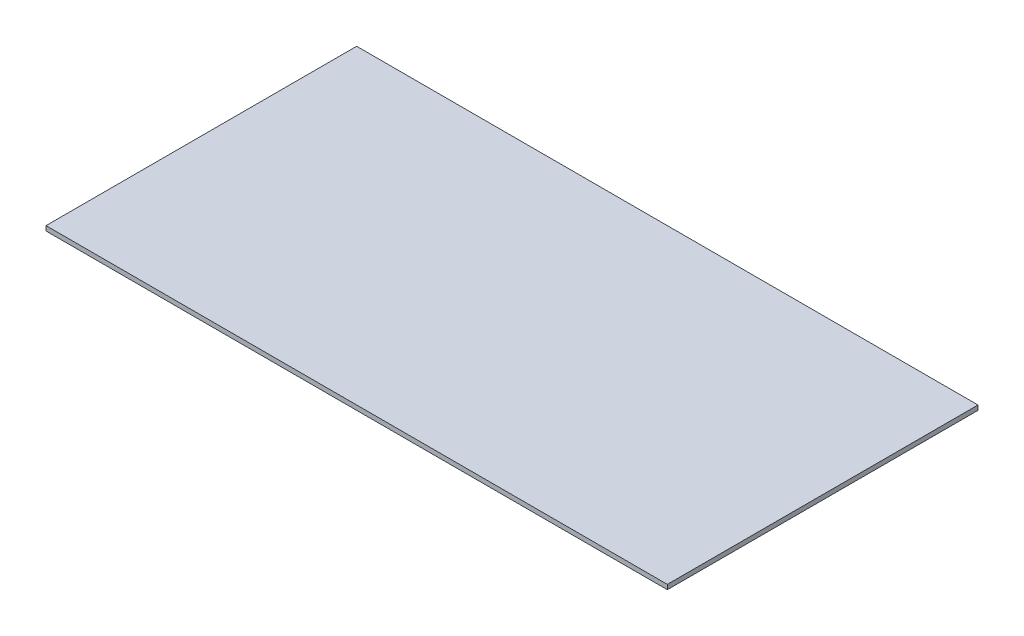
ISO-10303-21;
HEADER;
FILE_DESCRIPTION(('STEP AP214'),'2;1');
FILE_NAME('part.step','',(''),(''),'','','');
FILE_SCHEMA(('AUTOMOTIVE_DESIGN { 1 0 10303 214 1 1 1 1 }'));
ENDSEC;
DATA;
#1=APPLICATION_CONTEXT('core data for automotive mechanical design processes');
#2=APPLICATION_PROTOCOL_DEFINITION('international standard','automotive_design',2000,#1);
#3=PRODUCT_CONTEXT('',#1,'mechanical');
#4=PRODUCT('Part','Part','',(#3));
#5=PRODUCT_RELATED_PRODUCT_CATEGORY('part','',(#4));
#6=PRODUCT_DEFINITION_FORMATION('','',#4);
#7=PRODUCT_DEFINITION_CONTEXT('part definition',#1,'design');
#8=PRODUCT_DEFINITION('design','',#6,#7);
#9=PRODUCT_DEFINITION_SHAPE('','',#8);
#10=(LENGTH_UNIT() NAMED_UNIT(*) SI_UNIT(.MILLI.,.METRE.));
#11=(NAMED_UNIT(*) PLANE_ANGLE_UNIT() SI_UNIT($,.RADIAN.));
#12=(NAMED_UNIT(*) SI_UNIT($,.STERADIAN.) SOLID_ANGLE_UNIT());
#13=UNCERTAINTY_MEASURE_WITH_UNIT(LENGTH_MEASURE(1.E-05),#10,'distance_accuracy_value','');
#14=(GEOMETRIC_REPRESENTATION_CONTEXT(3) GLOBAL_UNCERTAINTY_ASSIGNED_CONTEXT((#13)) GLOBAL_UNIT_ASSIGNED_CONTEXT((#10,
#11,#12)) REPRESENTATION_CONTEXT('',''));
#15=CARTESIAN_POINT('',(0.,0.,0.));
#16=DIRECTION('',(0.,0.,1.));
#17=DIRECTION('',(1.,0.,0.));
#18=AXIS2_PLACEMENT_3D('',#15,#16,#17);
#19=CARTESIAN_POINT('',(0.,3.,0.));
#20=DIRECTION('',(1.,0.,0.));
#21=DIRECTION('',(0.,0.,-1.));
#22=AXIS2_PLACEMENT_3D('',#19,#20,#21);
#23=PLANE('',#22);
#24=DIRECTION('',(0.,0.,1.));
#25=VECTOR('',#24,1.);
#26=CARTESIAN_POINT('',(0.,0.,0.));
#27=LINE('',#26,#25);
#28=CARTESIAN_POINT('',(0.,0.,-200.));
#29=VERTEX_POINT('',#28);
#30=CARTESIAN_POINT('',(0.,0.,0.));
#31=VERTEX_POINT('',#30);
#32=EDGE_CURVE('E107',#29,#31,#27,.T.);
#33=ORIENTED_EDGE('',*,*,#32,.T.);
#34=DIRECTION('',(0.,-1.,0.));
#35=VECTOR('',#34,1.);
#36=CARTESIAN_POINT('',(0.,3.,0.));
#37=LINE('',#36,#35);
#38=CARTESIAN_POINT('',(0.,3.,0.));
#39=VERTEX_POINT('',#38);
#40=EDGE_CURVE('E11',#39,#31,#37,.T.);
#41=ORIENTED_EDGE('',*,*,#40,.F.);
#42=DIRECTION('',(0.,0.,1.));
#43=VECTOR('',#42,1.);
#44=CARTESIAN_POINT('',(0.,3.,0.));
#45=LINE('',#44,#43);
#46=CARTESIAN_POINT('',(0.,3.,-200.));
#47=VERTEX_POINT('',#46);
#48=EDGE_CURVE('E91',#47,#39,#45,.T.);
#49=ORIENTED_EDGE('',*,*,#48,.F.);
#50=DIRECTION('',(0.,-1.,0.));
#51=VECTOR('',#50,1.);
#52=CARTESIAN_POINT('',(0.,3.,-200.));
#53=LINE('',#52,#51);
#54=EDGE_CURVE('E103',#47,#29,#53,.T.);
#55=ORIENTED_EDGE('',*,*,#54,.T.);
#56=EDGE_LOOP('',(#33,#41,#49,#55));
#57=FACE_BOUND('',#56,.T.);
#58=ADVANCED_FACE('F39',(#57),#23,.F.);
#59=CARTESIAN_POINT('',(0.,3.,0.));
#60=DIRECTION('',(0.,0.,-1.));
#61=DIRECTION('',(-1.,0.,0.));
#62=AXIS2_PLACEMENT_3D('',#59,#60,#61);
#63=PLANE('',#62);
#64=DIRECTION('',(1.,0.,0.));
#65=VECTOR('',#64,1.);
#66=CARTESIAN_POINT('',(0.,0.,0.));
#67=LINE('',#66,#65);
#68=CARTESIAN_POINT('',(400.,0.,0.));
#69=VERTEX_POINT('',#68);
#70=EDGE_CURVE('E96',#31,#69,#67,.T.);
#71=ORIENTED_EDGE('',*,*,#70,.T.);
#72=DIRECTION('',(0.,-1.,0.));
#73=VECTOR('',#72,1.);
#74=CARTESIAN_POINT('',(400.,3.,0.));
#75=LINE('',#74,#73);
#76=CARTESIAN_POINT('',(400.,3.,0.));
#77=VERTEX_POINT('',#76);
#78=EDGE_CURVE('E48',#77,#69,#75,.T.);
#79=ORIENTED_EDGE('',*,*,#78,.F.);
#80=DIRECTION('',(1.,0.,0.));
#81=VECTOR('',#80,1.);
#82=CARTESIAN_POINT('',(0.,3.,0.));
#83=LINE('',#82,#81);
#84=EDGE_CURVE('E86',#39,#77,#83,.T.);
#85=ORIENTED_EDGE('',*,*,#84,.F.);
#86=ORIENTED_EDGE('',*,*,#40,.T.);
#87=EDGE_LOOP('',(#71,#79,#85,#86));
#88=FACE_BOUND('',#87,.T.);
#89=ADVANCED_FACE('F95',(#88),#63,.F.);
#90=CARTESIAN_POINT('',(400.,3.,0.));
#91=DIRECTION('',(-1.,0.,0.));
#92=DIRECTION('',(0.,0.,1.));
#93=AXIS2_PLACEMENT_3D('',#90,#91,#92);
#94=PLANE('',#93);
#95=DIRECTION('',(0.,0.,-1.));
#96=VECTOR('',#95,1.);
#97=CARTESIAN_POINT('',(400.,0.,0.));
#98=LINE('',#97,#96);
#99=CARTESIAN_POINT('',(400.,0.,-200.));
#100=VERTEX_POINT('',#99);
#101=EDGE_CURVE('E73',#69,#100,#98,.T.);
#102=ORIENTED_EDGE('',*,*,#101,.T.);
#103=DIRECTION('',(0.,-1.,0.));
#104=VECTOR('',#103,1.);
#105=CARTESIAN_POINT('',(400.,3.,-200.));
#106=LINE('',#105,#104);
#107=CARTESIAN_POINT('',(400.,3.,-200.));
#108=VERTEX_POINT('',#107);
#109=EDGE_CURVE('E98',#108,#100,#106,.T.);
#110=ORIENTED_EDGE('',*,*,#109,.F.);
#111=DIRECTION('',(0.,0.,-1.));
#112=VECTOR('',#111,1.);
#113=CARTESIAN_POINT('',(400.,3.,0.));
#114=LINE('',#113,#112);
#115=EDGE_CURVE('E89',#77,#108,#114,.T.);
#116=ORIENTED_EDGE('',*,*,#115,.F.);
#117=ORIENTED_EDGE('',*,*,#78,.T.);
#118=EDGE_LOOP('',(#102,#110,#116,#117));
#119=FACE_BOUND('',#118,.T.);
#120=ADVANCED_FACE('F99',(#119),#94,.F.);
#121=CARTESIAN_POINT('',(0.,3.,-200.));
#122=DIRECTION('',(0.,0.,1.));
#123=DIRECTION('',(1.,0.,0.));
#124=AXIS2_PLACEMENT_3D('',#121,#122,#123);
#125=PLANE('',#124);
#126=DIRECTION('',(-1.,0.,0.));
#127=VECTOR('',#126,1.);
#128=CARTESIAN_POINT('',(0.,0.,-200.));
#129=LINE('',#128,#127);
#130=EDGE_CURVE('E79',#100,#29,#129,.T.);
#131=ORIENTED_EDGE('',*,*,#130,.T.);
#132=ORIENTED_EDGE('',*,*,#54,.F.);
#133=DIRECTION('',(-1.,0.,0.));
#134=VECTOR('',#133,1.);
#135=CARTESIAN_POINT('',(0.,3.,-200.));
#136=LINE('',#135,#134);
#137=EDGE_CURVE('E56',#108,#47,#136,.T.);
#138=ORIENTED_EDGE('',*,*,#137,.F.);
#139=ORIENTED_EDGE('',*,*,#109,.T.);
#140=EDGE_LOOP('',(#131,#132,#138,#139));
#141=FACE_BOUND('',#140,.T.);
#142=ADVANCED_FACE('F120',(#141),#125,.F.);
#143=CARTESIAN_POINT('',(0.,3.,0.));
#144=DIRECTION('',(0.,-1.,0.));
#145=DIRECTION('',(0.,0.,-1.));
#146=AXIS2_PLACEMENT_3D('',#143,#144,#145);
#147=PLANE('',#146);
#148=ORIENTED_EDGE('',*,*,#48,.T.);
#149=ORIENTED_EDGE('',*,*,#84,.T.);
#150=ORIENTED_EDGE('',*,*,#115,.T.);
#151=ORIENTED_EDGE('',*,*,#137,.T.);
#152=EDGE_LOOP('',(#148,#149,#150,#151));
#153=FACE_BOUND('',#152,.T.);
#154=ADVANCED_FACE('F87',(#153),#147,.F.);
#155=CARTESIAN_POINT('',(0.,0.,0.));
#156=DIRECTION('',(0.,-1.,0.));
#157=DIRECTION('',(0.,0.,-1.));
#158=AXIS2_PLACEMENT_3D('',#155,#156,#157);
#159=PLANE('',#158);
#160=ORIENTED_EDGE('',*,*,#32,.F.);
#161=ORIENTED_EDGE('',*,*,#130,.F.);
#162=ORIENTED_EDGE('',*,*,#101,.F.);
#163=ORIENTED_EDGE('',*,*,#70,.F.);
#164=EDGE_LOOP('',(#160,#161,#162,#163));
#165=FACE_BOUND('',#164,.T.);
#166=ADVANCED_FACE('F123',(#165),#159,.T.);
#167=CLOSED_SHELL('',(#58,#89,#120,#142,#154,#166));
#168=MANIFOLD_SOLID_BREP('B2',#167);
#169=ADVANCED_BREP_SHAPE_REPRESENTATION('',(#18,#168),#14);
#170=SHAPE_DEFINITION_REPRESENTATION(#9,#169);
ENDSEC;
END-ISO-10303-21;
